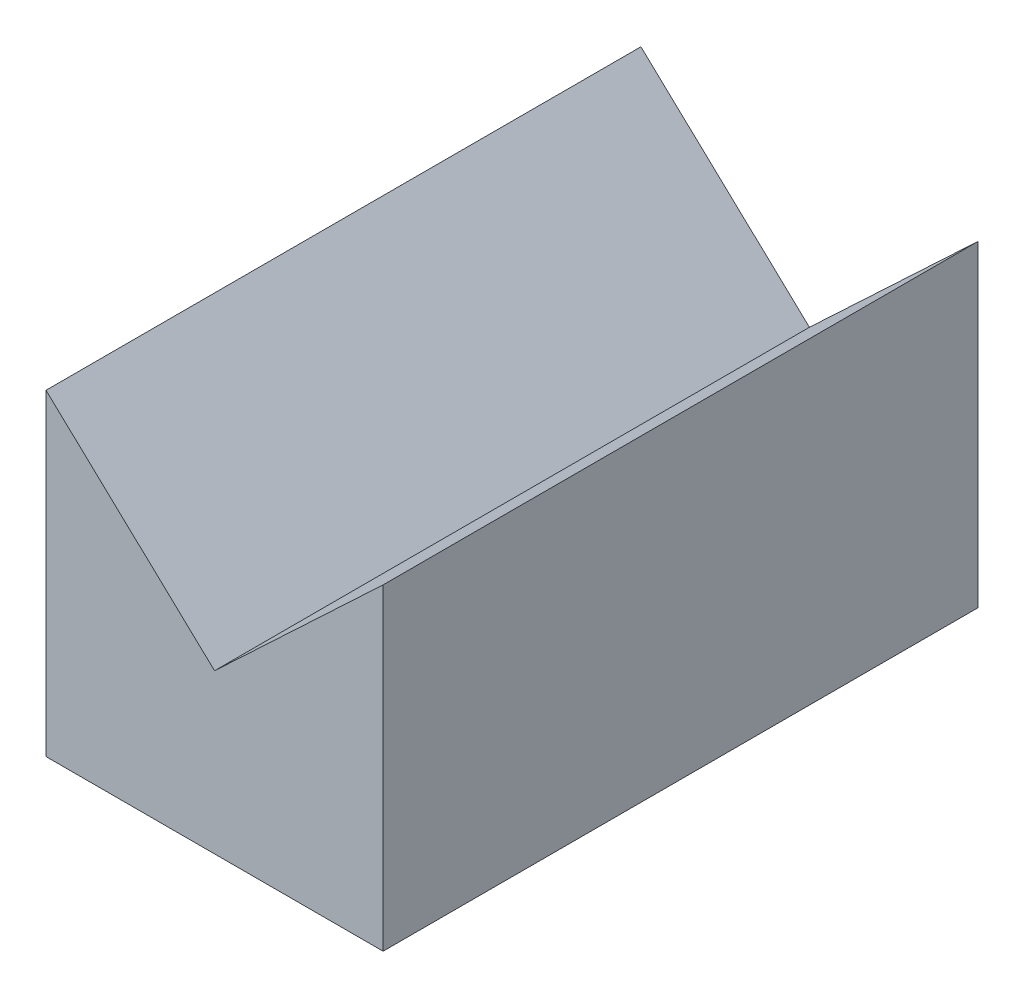
ISO-10303-21;
HEADER;
FILE_DESCRIPTION(('STEP AP214'),'2;1');
FILE_NAME('part.step','',(''),(''),'','','');
FILE_SCHEMA(('AUTOMOTIVE_DESIGN { 1 0 10303 214 1 1 1 1 }'));
ENDSEC;
DATA;
#1=APPLICATION_CONTEXT('core data for automotive mechanical design processes');
#2=APPLICATION_PROTOCOL_DEFINITION('international standard','automotive_design',2000,#1);
#3=PRODUCT_CONTEXT('',#1,'mechanical');
#4=PRODUCT('Part','Part','',(#3));
#5=PRODUCT_RELATED_PRODUCT_CATEGORY('part','',(#4));
#6=PRODUCT_DEFINITION_FORMATION('','',#4);
#7=PRODUCT_DEFINITION_CONTEXT('part definition',#1,'design');
#8=PRODUCT_DEFINITION('design','',#6,#7);
#9=PRODUCT_DEFINITION_SHAPE('','',#8);
#10=(LENGTH_UNIT() NAMED_UNIT(*) SI_UNIT(.MILLI.,.METRE.));
#11=(NAMED_UNIT(*) PLANE_ANGLE_UNIT() SI_UNIT($,.RADIAN.));
#12=(NAMED_UNIT(*) SI_UNIT($,.STERADIAN.) SOLID_ANGLE_UNIT());
#13=UNCERTAINTY_MEASURE_WITH_UNIT(LENGTH_MEASURE(1.E-05),#10,'distance_accuracy_value','');
#14=(GEOMETRIC_REPRESENTATION_CONTEXT(3) GLOBAL_UNCERTAINTY_ASSIGNED_CONTEXT((#13)) GLOBAL_UNIT_ASSIGNED_CONTEXT((#10,
#11,#12)) REPRESENTATION_CONTEXT('',''));
#15=CARTESIAN_POINT('',(0.,0.,0.));
#16=DIRECTION('',(0.,0.,1.));
#17=DIRECTION('',(1.,0.,0.));
#18=AXIS2_PLACEMENT_3D('',#15,#16,#17);
#19=CARTESIAN_POINT('',(4.25,4.,0.));
#20=DIRECTION('',(0.,0.,1.));
#21=DIRECTION('',(1.,0.,0.));
#22=AXIS2_PLACEMENT_3D('',#19,#20,#21);
#23=PLANE('',#22);
#24=DIRECTION('',(-0.728199992692803,0.685364699004991,0.));
#25=VECTOR('',#24,1.);
#26=CARTESIAN_POINT('',(4.25,4.,0.));
#27=LINE('',#26,#25);
#28=CARTESIAN_POINT('',(4.25,4.,0.));
#29=VERTEX_POINT('',#28);
#30=CARTESIAN_POINT('',(0.,8.,0.));
#31=VERTEX_POINT('',#30);
#32=EDGE_CURVE('E27',#29,#31,#27,.T.);
#33=ORIENTED_EDGE('',*,*,#32,.F.);
#34=DIRECTION('',(0.728199992692803,0.685364699004991,0.));
#35=VECTOR('',#34,1.);
#36=CARTESIAN_POINT('',(4.25,4.,0.));
#37=LINE('',#36,#35);
#38=CARTESIAN_POINT('',(8.5,8.,0.));
#39=VERTEX_POINT('',#38);
#40=EDGE_CURVE('E113',#29,#39,#37,.T.);
#41=ORIENTED_EDGE('',*,*,#40,.T.);
#42=DIRECTION('',(0.,1.,0.));
#43=VECTOR('',#42,1.);
#44=CARTESIAN_POINT('',(8.5,0.,0.));
#45=LINE('',#44,#43);
#46=CARTESIAN_POINT('',(8.5,0.,0.));
#47=VERTEX_POINT('',#46);
#48=EDGE_CURVE('E94',#47,#39,#45,.T.);
#49=ORIENTED_EDGE('',*,*,#48,.F.);
#50=DIRECTION('',(1.,0.,0.));
#51=VECTOR('',#50,1.);
#52=CARTESIAN_POINT('',(0.,0.,0.));
#53=LINE('',#52,#51);
#54=CARTESIAN_POINT('',(0.,0.,0.));
#55=VERTEX_POINT('',#54);
#56=EDGE_CURVE('E118',#55,#47,#53,.T.);
#57=ORIENTED_EDGE('',*,*,#56,.F.);
#58=DIRECTION('',(0.,-1.,0.));
#59=VECTOR('',#58,1.);
#60=CARTESIAN_POINT('',(0.,8.,0.));
#61=LINE('',#60,#59);
#62=EDGE_CURVE('E73',#31,#55,#61,.T.);
#63=ORIENTED_EDGE('',*,*,#62,.F.);
#64=EDGE_LOOP('',(#33,#41,#49,#57,#63));
#65=FACE_BOUND('',#64,.T.);
#66=ADVANCED_FACE('F16',(#65),#23,.F.);
#67=CARTESIAN_POINT('',(4.25,4.,15.));
#68=DIRECTION('',(0.,0.,1.));
#69=DIRECTION('',(1.,0.,0.));
#70=AXIS2_PLACEMENT_3D('',#67,#68,#69);
#71=PLANE('',#70);
#72=DIRECTION('',(-0.728199992692803,0.685364699004991,0.));
#73=VECTOR('',#72,1.);
#74=CARTESIAN_POINT('',(4.25,4.,15.));
#75=LINE('',#74,#73);
#76=CARTESIAN_POINT('',(4.25,4.,15.));
#77=VERTEX_POINT('',#76);
#78=CARTESIAN_POINT('',(0.,8.,15.));
#79=VERTEX_POINT('',#78);
#80=EDGE_CURVE('E10',#77,#79,#75,.T.);
#81=ORIENTED_EDGE('',*,*,#80,.T.);
#82=DIRECTION('',(0.,-1.,0.));
#83=VECTOR('',#82,1.);
#84=CARTESIAN_POINT('',(0.,8.,15.));
#85=LINE('',#84,#83);
#86=CARTESIAN_POINT('',(0.,0.,15.));
#87=VERTEX_POINT('',#86);
#88=EDGE_CURVE('E65',#79,#87,#85,.T.);
#89=ORIENTED_EDGE('',*,*,#88,.T.);
#90=DIRECTION('',(1.,0.,0.));
#91=VECTOR('',#90,1.);
#92=CARTESIAN_POINT('',(0.,0.,15.));
#93=LINE('',#92,#91);
#94=CARTESIAN_POINT('',(8.5,0.,15.));
#95=VERTEX_POINT('',#94);
#96=EDGE_CURVE('E79',#87,#95,#93,.T.);
#97=ORIENTED_EDGE('',*,*,#96,.T.);
#98=DIRECTION('',(0.,1.,0.));
#99=VECTOR('',#98,1.);
#100=CARTESIAN_POINT('',(8.5,0.,15.));
#101=LINE('',#100,#99);
#102=CARTESIAN_POINT('',(8.5,8.,15.));
#103=VERTEX_POINT('',#102);
#104=EDGE_CURVE('E85',#95,#103,#101,.T.);
#105=ORIENTED_EDGE('',*,*,#104,.T.);
#106=DIRECTION('',(-0.728199992692803,-0.685364699004991,0.));
#107=VECTOR('',#106,1.);
#108=CARTESIAN_POINT('',(4.25,4.,15.));
#109=LINE('',#108,#107);
#110=EDGE_CURVE('E89',#103,#77,#109,.T.);
#111=ORIENTED_EDGE('',*,*,#110,.T.);
#112=EDGE_LOOP('',(#81,#89,#97,#105,#111));
#113=FACE_BOUND('',#112,.T.);
#114=ADVANCED_FACE('F87',(#113),#71,.T.);
#115=CARTESIAN_POINT('',(4.25,4.,0.));
#116=DIRECTION('',(0.685364699004991,0.728199992692803,0.));
#117=DIRECTION('',(0.,0.,-1.));
#118=AXIS2_PLACEMENT_3D('',#115,#116,#117);
#119=PLANE('',#118);
#120=ORIENTED_EDGE('',*,*,#32,.T.);
#121=DIRECTION('',(0.,0.,1.));
#122=VECTOR('',#121,1.);
#123=CARTESIAN_POINT('',(0.,8.,0.));
#124=LINE('',#123,#122);
#125=EDGE_CURVE('E126',#31,#79,#124,.T.);
#126=ORIENTED_EDGE('',*,*,#125,.T.);
#127=ORIENTED_EDGE('',*,*,#80,.F.);
#128=DIRECTION('',(0.,0.,1.));
#129=VECTOR('',#128,1.);
#130=CARTESIAN_POINT('',(4.25,4.,0.));
#131=LINE('',#130,#129);
#132=EDGE_CURVE('E106',#29,#77,#131,.T.);
#133=ORIENTED_EDGE('',*,*,#132,.F.);
#134=EDGE_LOOP('',(#120,#126,#127,#133));
#135=FACE_BOUND('',#134,.T.);
#136=ADVANCED_FACE('F190',(#135),#119,.T.);
#137=CARTESIAN_POINT('',(0.,8.,0.));
#138=DIRECTION('',(-1.,0.,0.));
#139=DIRECTION('',(0.,0.,1.));
#140=AXIS2_PLACEMENT_3D('',#137,#138,#139);
#141=PLANE('',#140);
#142=ORIENTED_EDGE('',*,*,#62,.T.);
#143=DIRECTION('',(0.,0.,1.));
#144=VECTOR('',#143,1.);
#145=CARTESIAN_POINT('',(0.,0.,0.));
#146=LINE('',#145,#144);
#147=EDGE_CURVE('E122',#55,#87,#146,.T.);
#148=ORIENTED_EDGE('',*,*,#147,.T.);
#149=ORIENTED_EDGE('',*,*,#88,.F.);
#150=ORIENTED_EDGE('',*,*,#125,.F.);
#151=EDGE_LOOP('',(#142,#148,#149,#150));
#152=FACE_BOUND('',#151,.T.);
#153=ADVANCED_FACE('F194',(#152),#141,.T.);
#154=CARTESIAN_POINT('',(0.,0.,0.));
#155=DIRECTION('',(0.,-1.,0.));
#156=DIRECTION('',(-1.,0.,0.));
#157=AXIS2_PLACEMENT_3D('',#154,#155,#156);
#158=PLANE('',#157);
#159=ORIENTED_EDGE('',*,*,#56,.T.);
#160=DIRECTION('',(0.,0.,1.));
#161=VECTOR('',#160,1.);
#162=CARTESIAN_POINT('',(8.5,0.,0.));
#163=LINE('',#162,#161);
#164=EDGE_CURVE('E20',#47,#95,#163,.T.);
#165=ORIENTED_EDGE('',*,*,#164,.T.);
#166=ORIENTED_EDGE('',*,*,#96,.F.);
#167=ORIENTED_EDGE('',*,*,#147,.F.);
#168=EDGE_LOOP('',(#159,#165,#166,#167));
#169=FACE_BOUND('',#168,.T.);
#170=ADVANCED_FACE('F186',(#169),#158,.T.);
#171=CARTESIAN_POINT('',(8.5,0.,0.));
#172=DIRECTION('',(1.,0.,0.));
#173=DIRECTION('',(0.,1.,0.));
#174=AXIS2_PLACEMENT_3D('',#171,#172,#173);
#175=PLANE('',#174);
#176=ORIENTED_EDGE('',*,*,#48,.T.);
#177=DIRECTION('',(0.,0.,1.));
#178=VECTOR('',#177,1.);
#179=CARTESIAN_POINT('',(8.5,8.,0.));
#180=LINE('',#179,#178);
#181=EDGE_CURVE('E97',#39,#103,#180,.T.);
#182=ORIENTED_EDGE('',*,*,#181,.T.);
#183=ORIENTED_EDGE('',*,*,#104,.F.);
#184=ORIENTED_EDGE('',*,*,#164,.F.);
#185=EDGE_LOOP('',(#176,#182,#183,#184));
#186=FACE_BOUND('',#185,.T.);
#187=ADVANCED_FACE('F18',(#186),#175,.T.);
#188=CARTESIAN_POINT('',(8.5,8.,0.));
#189=DIRECTION('',(-0.685364699004991,0.728199992692803,0.));
#190=DIRECTION('',(0.,0.,1.));
#191=AXIS2_PLACEMENT_3D('',#188,#189,#190);
#192=PLANE('',#191);
#193=ORIENTED_EDGE('',*,*,#40,.F.);
#194=ORIENTED_EDGE('',*,*,#132,.T.);
#195=ORIENTED_EDGE('',*,*,#110,.F.);
#196=ORIENTED_EDGE('',*,*,#181,.F.);
#197=EDGE_LOOP('',(#193,#194,#195,#196));
#198=FACE_BOUND('',#197,.T.);
#199=ADVANCED_FACE('F104',(#198),#192,.T.);
#200=CLOSED_SHELL('',(#66,#114,#136,#153,#170,#187,#199));
#201=MANIFOLD_SOLID_BREP('B1',#200);
#202=ADVANCED_BREP_SHAPE_REPRESENTATION('',(#18,#201),#14);
#203=SHAPE_DEFINITION_REPRESENTATION(#9,#202);
ENDSEC;
END-ISO-10303-21;
